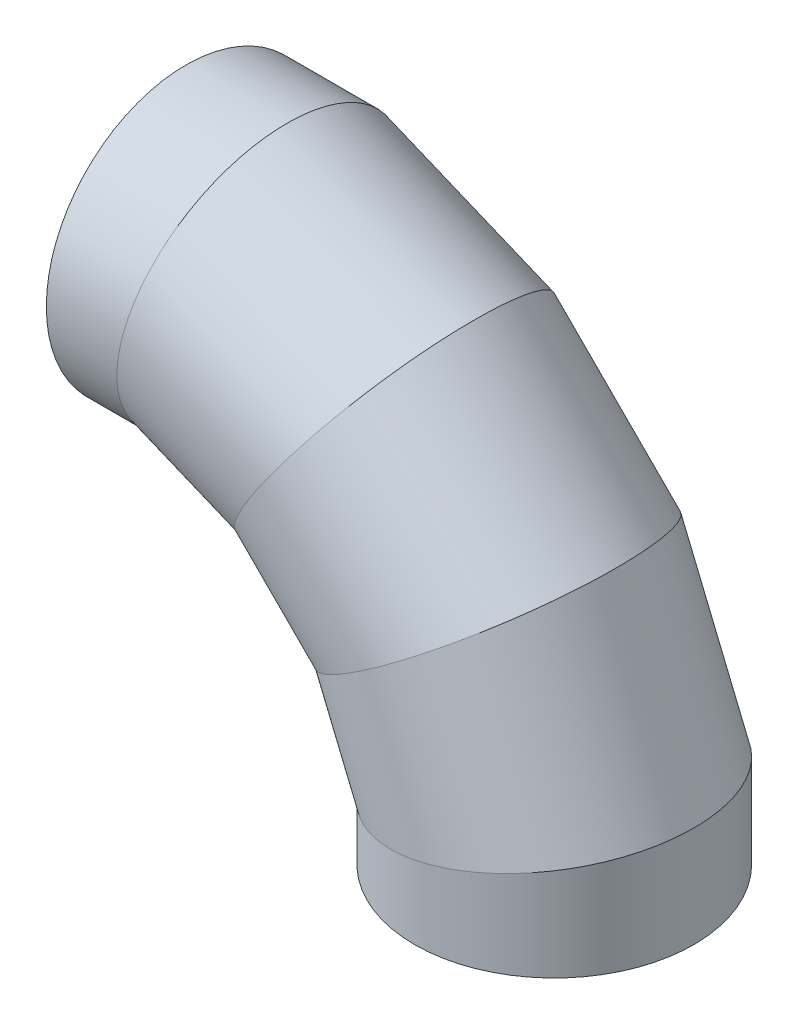
ISO-10303-21;
HEADER;
FILE_DESCRIPTION(('STEP AP214'),'2;1');
FILE_NAME('part.step','',(''),(''),'','','');
FILE_SCHEMA(('AUTOMOTIVE_DESIGN { 1 0 10303 214 1 1 1 1 }'));
ENDSEC;
DATA;
#1=APPLICATION_CONTEXT('core data for automotive mechanical design processes');
#2=APPLICATION_PROTOCOL_DEFINITION('international standard','automotive_design',2000,#1);
#3=PRODUCT_CONTEXT('',#1,'mechanical');
#4=PRODUCT('Part','Part','',(#3));
#5=PRODUCT_RELATED_PRODUCT_CATEGORY('part','',(#4));
#6=PRODUCT_DEFINITION_FORMATION('','',#4);
#7=PRODUCT_DEFINITION_CONTEXT('part definition',#1,'design');
#8=PRODUCT_DEFINITION('design','',#6,#7);
#9=PRODUCT_DEFINITION_SHAPE('','',#8);
#10=(LENGTH_UNIT() NAMED_UNIT(*) SI_UNIT(.MILLI.,.METRE.));
#11=(NAMED_UNIT(*) PLANE_ANGLE_UNIT() SI_UNIT($,.RADIAN.));
#12=(NAMED_UNIT(*) SI_UNIT($,.STERADIAN.) SOLID_ANGLE_UNIT());
#13=UNCERTAINTY_MEASURE_WITH_UNIT(LENGTH_MEASURE(1.E-05),#10,'distance_accuracy_value','');
#14=(GEOMETRIC_REPRESENTATION_CONTEXT(3) GLOBAL_UNCERTAINTY_ASSIGNED_CONTEXT((#13)) GLOBAL_UNIT_ASSIGNED_CONTEXT((#10,
#11,#12)) REPRESENTATION_CONTEXT('',''));
#15=CARTESIAN_POINT('',(0.,0.,0.));
#16=DIRECTION('',(0.,0.,1.));
#17=DIRECTION('',(1.,0.,0.));
#18=AXIS2_PLACEMENT_3D('',#15,#16,#17);
#19=CARTESIAN_POINT('',(1000.,0.,0.));
#20=DIRECTION('',(0.,1.,0.));
#21=DIRECTION('',(0.,0.,1.));
#22=AXIS2_PLACEMENT_3D('',#19,#20,#21);
#23=PLANE('',#22);
#24=CARTESIAN_POINT('',(1000.,0.,0.));
#25=DIRECTION('',(0.,1.,0.));
#26=DIRECTION('',(0.,0.,1.));
#27=AXIS2_PLACEMENT_3D('',#24,#25,#26);
#28=CIRCLE('',#27,375.);
#29=CARTESIAN_POINT('',(1000.,0.,375.));
#30=VERTEX_POINT('',#29);
#31=EDGE_CURVE('E75',#30,#30,#28,.T.);
#32=ORIENTED_EDGE('',*,*,#31,.T.);
#33=EDGE_LOOP('',(#32));
#34=FACE_BOUND('',#33,.T.);
#35=CARTESIAN_POINT('',(1000.,0.,0.));
#36=DIRECTION('',(0.,1.,0.));
#37=DIRECTION('',(0.,0.,1.));
#38=AXIS2_PLACEMENT_3D('',#35,#36,#37);
#39=CIRCLE('',#38,379.);
#40=CARTESIAN_POINT('',(1000.,0.,379.));
#41=VERTEX_POINT('',#40);
#42=EDGE_CURVE('E69',#41,#41,#39,.T.);
#43=ORIENTED_EDGE('',*,*,#42,.F.);
#44=EDGE_LOOP('',(#43));
#45=FACE_BOUND('',#44,.T.);
#46=ADVANCED_FACE('F39',(#34,#45),#23,.F.);
#47=CARTESIAN_POINT('',(0.,1000.,0.));
#48=DIRECTION('',(-1.,0.,0.));
#49=DIRECTION('',(0.,0.,1.));
#50=AXIS2_PLACEMENT_3D('',#47,#48,#49);
#51=PLANE('',#50);
#52=CARTESIAN_POINT('',(0.,1000.,0.));
#53=DIRECTION('',(-1.,0.,0.));
#54=DIRECTION('',(0.,0.,1.));
#55=AXIS2_PLACEMENT_3D('',#52,#53,#54);
#56=CIRCLE('',#55,375.);
#57=CARTESIAN_POINT('',(0.,1000.,375.));
#58=VERTEX_POINT('',#57);
#59=EDGE_CURVE('E132',#58,#58,#56,.T.);
#60=ORIENTED_EDGE('',*,*,#59,.F.);
#61=EDGE_LOOP('',(#60));
#62=FACE_BOUND('',#61,.T.);
#63=CARTESIAN_POINT('',(0.,1000.,0.));
#64=DIRECTION('',(-1.,0.,0.));
#65=DIRECTION('',(0.,0.,1.));
#66=AXIS2_PLACEMENT_3D('',#63,#64,#65);
#67=CIRCLE('',#66,379.);
#68=CARTESIAN_POINT('',(0.,1000.,379.));
#69=VERTEX_POINT('',#68);
#70=EDGE_CURVE('E43',#69,#69,#67,.T.);
#71=ORIENTED_EDGE('',*,*,#70,.T.);
#72=EDGE_LOOP('',(#71));
#73=FACE_BOUND('',#72,.T.);
#74=ADVANCED_FACE('F81',(#62,#73),#51,.T.);
#75=CARTESIAN_POINT('',(1000.,363.11507046789,0.));
#76=DIRECTION('',(0.,-1.,0.));
#77=DIRECTION('',(0.,0.,-1.));
#78=AXIS2_PLACEMENT_3D('',#75,#76,#77);
#79=CYLINDRICAL_SURFACE('',#78,379.);
#80=CARTESIAN_POINT('',(1000.,198.912367379666,0.));
#81=DIRECTION('',(0.195090322016136,-0.980785280403229,0.));
#82=DIRECTION('',(-0.980785280403229,-0.195090322016136,0.));
#83=AXIS2_PLACEMENT_3D('',#80,#81,#82);
#84=ELLIPSE('',#83,386.425048960953,379.);
#85=CARTESIAN_POINT('',(1000.,198.912367379666,379.));
#86=VERTEX_POINT('',#85);
#87=EDGE_CURVE('E64',#86,#86,#84,.T.);
#88=ORIENTED_EDGE('',*,*,#87,.T.);
#89=EDGE_LOOP('',(#88));
#90=FACE_BOUND('',#89,.T.);
#91=ORIENTED_EDGE('',*,*,#42,.T.);
#92=EDGE_LOOP('',(#91));
#93=FACE_BOUND('',#92,.T.);
#94=ADVANCED_FACE('F65',(#90,#93),#79,.T.);
#95=CARTESIAN_POINT('',(784.921411001146,718.158013916743,0.));
#96=DIRECTION('',(0.382683432365105,-0.92387953251128,0.));
#97=DIRECTION('',(0.923879532511281,0.382683432365105,0.));
#98=AXIS2_PLACEMENT_3D('',#95,#96,#97);
#99=CYLINDRICAL_SURFACE('',#98,379.);
#100=CARTESIAN_POINT('',(847.759065022569,566.454497350523,0.));
#101=DIRECTION('',(0.555570233019605,-0.831469612302544,0.));
#102=DIRECTION('',(-0.831469612302544,-0.555570233019605,0.));
#103=AXIS2_PLACEMENT_3D('',#100,#101,#102);
#104=ELLIPSE('',#103,386.425048960952,379.);
#105=CARTESIAN_POINT('',(847.759065022569,566.454497350523,379.));
#106=VERTEX_POINT('',#105);
#107=EDGE_CURVE('E68',#106,#106,#104,.T.);
#108=ORIENTED_EDGE('',*,*,#107,.T.);
#109=EDGE_LOOP('',(#108));
#110=FACE_BOUND('',#109,.T.);
#111=ORIENTED_EDGE('',*,*,#87,.F.);
#112=EDGE_LOOP('',(#111));
#113=FACE_BOUND('',#112,.T.);
#114=ADVANCED_FACE('F98',(#110,#113),#99,.T.);
#115=CARTESIAN_POINT('',(450.345652507684,963.867909865417,0.));
#116=DIRECTION('',(0.70710678118654,-0.707106781186555,0.));
#117=DIRECTION('',(0.707106781186555,0.70710678118654,0.));
#118=AXIS2_PLACEMENT_3D('',#115,#116,#117);
#119=CYLINDRICAL_SURFACE('',#118,379.);
#120=CARTESIAN_POINT('',(566.454497350524,847.759065022574,0.));
#121=DIRECTION('',(0.831469612302541,-0.555570233019609,0.));
#122=DIRECTION('',(-0.555570233019609,-0.831469612302541,0.));
#123=AXIS2_PLACEMENT_3D('',#120,#121,#122);
#124=ELLIPSE('',#123,386.425048960953,379.);
#125=CARTESIAN_POINT('',(566.454497350524,847.759065022574,379.));
#126=VERTEX_POINT('',#125);
#127=EDGE_CURVE('E56',#126,#126,#124,.T.);
#128=ORIENTED_EDGE('',*,*,#127,.T.);
#129=EDGE_LOOP('',(#128));
#130=FACE_BOUND('',#129,.T.);
#131=ORIENTED_EDGE('',*,*,#107,.F.);
#132=EDGE_LOOP('',(#131));
#133=FACE_BOUND('',#132,.T.);
#134=ADVANCED_FACE('F94',(#130,#133),#119,.T.);
#135=CARTESIAN_POINT('',(47.2088508134316,1062.83765402143,0.));
#136=DIRECTION('',(0.923879532511285,-0.382683432365094,0.));
#137=DIRECTION('',(0.382683432365094,0.923879532511285,0.));
#138=AXIS2_PLACEMENT_3D('',#135,#136,#137);
#139=CYLINDRICAL_SURFACE('',#138,379.);
#140=CARTESIAN_POINT('',(198.912367379665,1000.,0.));
#141=DIRECTION('',(0.98078528040323,-0.19509032201613,0.));
#142=DIRECTION('',(-0.19509032201613,-0.98078528040323,0.));
#143=AXIS2_PLACEMENT_3D('',#140,#141,#142);
#144=ELLIPSE('',#143,386.425048960953,379.);
#145=CARTESIAN_POINT('',(198.912367379665,1000.,379.));
#146=VERTEX_POINT('',#145);
#147=EDGE_CURVE('E11',#146,#146,#144,.T.);
#148=ORIENTED_EDGE('',*,*,#147,.T.);
#149=EDGE_LOOP('',(#148));
#150=FACE_BOUND('',#149,.T.);
#151=ORIENTED_EDGE('',*,*,#127,.F.);
#152=EDGE_LOOP('',(#151));
#153=FACE_BOUND('',#152,.T.);
#154=ADVANCED_FACE('F86',(#150,#153),#139,.T.);
#155=CARTESIAN_POINT('',(0.,1000.,0.));
#156=DIRECTION('',(1.,0.,0.));
#157=DIRECTION('',(0.,0.,-1.));
#158=AXIS2_PLACEMENT_3D('',#155,#156,#157);
#159=CYLINDRICAL_SURFACE('',#158,379.);
#160=ORIENTED_EDGE('',*,*,#70,.F.);
#161=EDGE_LOOP('',(#160));
#162=FACE_BOUND('',#161,.T.);
#163=ORIENTED_EDGE('',*,*,#147,.F.);
#164=EDGE_LOOP('',(#163));
#165=FACE_BOUND('',#164,.T.);
#166=ADVANCED_FACE('F41',(#162,#165),#159,.T.);
#167=CARTESIAN_POINT('',(1000.,363.11507046789,0.));
#168=DIRECTION('',(0.,-1.,0.));
#169=DIRECTION('',(0.,0.,-1.));
#170=AXIS2_PLACEMENT_3D('',#167,#168,#169);
#171=CYLINDRICAL_SURFACE('',#170,375.);
#172=CARTESIAN_POINT('',(1000.,198.912367379666,0.));
#173=DIRECTION('',(0.195090322016136,-0.980785280403229,0.));
#174=DIRECTION('',(0.980785280403229,0.195090322016136,0.));
#175=AXIS2_PLACEMENT_3D('',#172,#173,#174);
#176=ELLIPSE('',#175,382.34668432812,375.);
#177=CARTESIAN_POINT('',(1375.,273.504505147041,0.));
#178=VERTEX_POINT('',#177);
#179=EDGE_CURVE('E143',#178,#178,#176,.T.);
#180=ORIENTED_EDGE('',*,*,#179,.F.);
#181=EDGE_LOOP('',(#180));
#182=FACE_BOUND('',#181,.T.);
#183=ORIENTED_EDGE('',*,*,#31,.F.);
#184=EDGE_LOOP('',(#183));
#185=FACE_BOUND('',#184,.T.);
#186=ADVANCED_FACE('F85',(#182,#185),#171,.F.);
#187=CARTESIAN_POINT('',(784.921411001146,718.158013916743,0.));
#188=DIRECTION('',(0.382683432365105,-0.92387953251128,0.));
#189=DIRECTION('',(0.923879532511281,0.382683432365105,0.));
#190=AXIS2_PLACEMENT_3D('',#187,#188,#189);
#191=CYLINDRICAL_SURFACE('',#190,375.);
#192=CARTESIAN_POINT('',(847.759065022569,566.454497350522,0.));
#193=DIRECTION('',(0.555570233019605,-0.831469612302544,0.));
#194=DIRECTION('',(0.831469612302544,0.555570233019605,0.));
#195=AXIS2_PLACEMENT_3D('',#192,#193,#194);
#196=ELLIPSE('',#195,382.346684328118,375.);
#197=CARTESIAN_POINT('',(1165.66871440603,778.874933856968,0.));
#198=VERTEX_POINT('',#197);
#199=EDGE_CURVE('E141',#198,#198,#196,.T.);
#200=ORIENTED_EDGE('',*,*,#199,.F.);
#201=EDGE_LOOP('',(#200));
#202=FACE_BOUND('',#201,.T.);
#203=ORIENTED_EDGE('',*,*,#179,.T.);
#204=EDGE_LOOP('',(#203));
#205=FACE_BOUND('',#204,.T.);
#206=ADVANCED_FACE('F91',(#202,#205),#191,.F.);
#207=CARTESIAN_POINT('',(450.345652507684,963.867909865417,0.));
#208=DIRECTION('',(0.70710678118654,-0.707106781186555,0.));
#209=DIRECTION('',(0.707106781186555,0.70710678118654,0.));
#210=AXIS2_PLACEMENT_3D('',#207,#208,#209);
#211=CYLINDRICAL_SURFACE('',#210,375.);
#212=CARTESIAN_POINT('',(566.454497350525,847.759065022574,0.));
#213=DIRECTION('',(0.831469612302541,-0.555570233019609,0.));
#214=DIRECTION('',(0.555570233019609,0.831469612302541,0.));
#215=AXIS2_PLACEMENT_3D('',#212,#213,#214);
#216=ELLIPSE('',#215,382.34668432812,375.);
#217=CARTESIAN_POINT('',(778.874933856973,1165.66871440604,0.));
#218=VERTEX_POINT('',#217);
#219=EDGE_CURVE('E136',#218,#218,#216,.T.);
#220=ORIENTED_EDGE('',*,*,#219,.F.);
#221=EDGE_LOOP('',(#220));
#222=FACE_BOUND('',#221,.T.);
#223=ORIENTED_EDGE('',*,*,#199,.T.);
#224=EDGE_LOOP('',(#223));
#225=FACE_BOUND('',#224,.T.);
#226=ADVANCED_FACE('F116',(#222,#225),#211,.F.);
#227=CARTESIAN_POINT('',(47.2088508134316,1062.83765402143,0.));
#228=DIRECTION('',(0.923879532511285,-0.382683432365094,0.));
#229=DIRECTION('',(0.382683432365094,0.923879532511285,0.));
#230=AXIS2_PLACEMENT_3D('',#227,#228,#229);
#231=CYLINDRICAL_SURFACE('',#230,375.);
#232=CARTESIAN_POINT('',(198.912367379666,1000.,0.));
#233=DIRECTION('',(0.98078528040323,-0.19509032201613,0.));
#234=DIRECTION('',(0.19509032201613,0.98078528040323,0.));
#235=AXIS2_PLACEMENT_3D('',#232,#233,#234);
#236=ELLIPSE('',#235,382.34668432812,375.);
#237=CARTESIAN_POINT('',(273.504505147038,1375.,0.));
#238=VERTEX_POINT('',#237);
#239=EDGE_CURVE('E73',#238,#238,#236,.T.);
#240=ORIENTED_EDGE('',*,*,#239,.F.);
#241=EDGE_LOOP('',(#240));
#242=FACE_BOUND('',#241,.T.);
#243=ORIENTED_EDGE('',*,*,#219,.T.);
#244=EDGE_LOOP('',(#243));
#245=FACE_BOUND('',#244,.T.);
#246=ADVANCED_FACE('F120',(#242,#245),#231,.F.);
#247=CARTESIAN_POINT('',(0.,1000.,0.));
#248=DIRECTION('',(1.,0.,0.));
#249=DIRECTION('',(0.,0.,-1.));
#250=AXIS2_PLACEMENT_3D('',#247,#248,#249);
#251=CYLINDRICAL_SURFACE('',#250,375.);
#252=ORIENTED_EDGE('',*,*,#59,.T.);
#253=EDGE_LOOP('',(#252));
#254=FACE_BOUND('',#253,.T.);
#255=ORIENTED_EDGE('',*,*,#239,.T.);
#256=EDGE_LOOP('',(#255));
#257=FACE_BOUND('',#256,.T.);
#258=ADVANCED_FACE('F110',(#254,#257),#251,.F.);
#259=CLOSED_SHELL('',(#46,#74,#94,#114,#134,#154,#166,#186,#206,#226,#246,#258));
#260=MANIFOLD_SOLID_BREP('B2',#259);
#261=ADVANCED_BREP_SHAPE_REPRESENTATION('',(#18,#260),#14);
#262=SHAPE_DEFINITION_REPRESENTATION(#9,#261);
ENDSEC;
END-ISO-10303-21;
